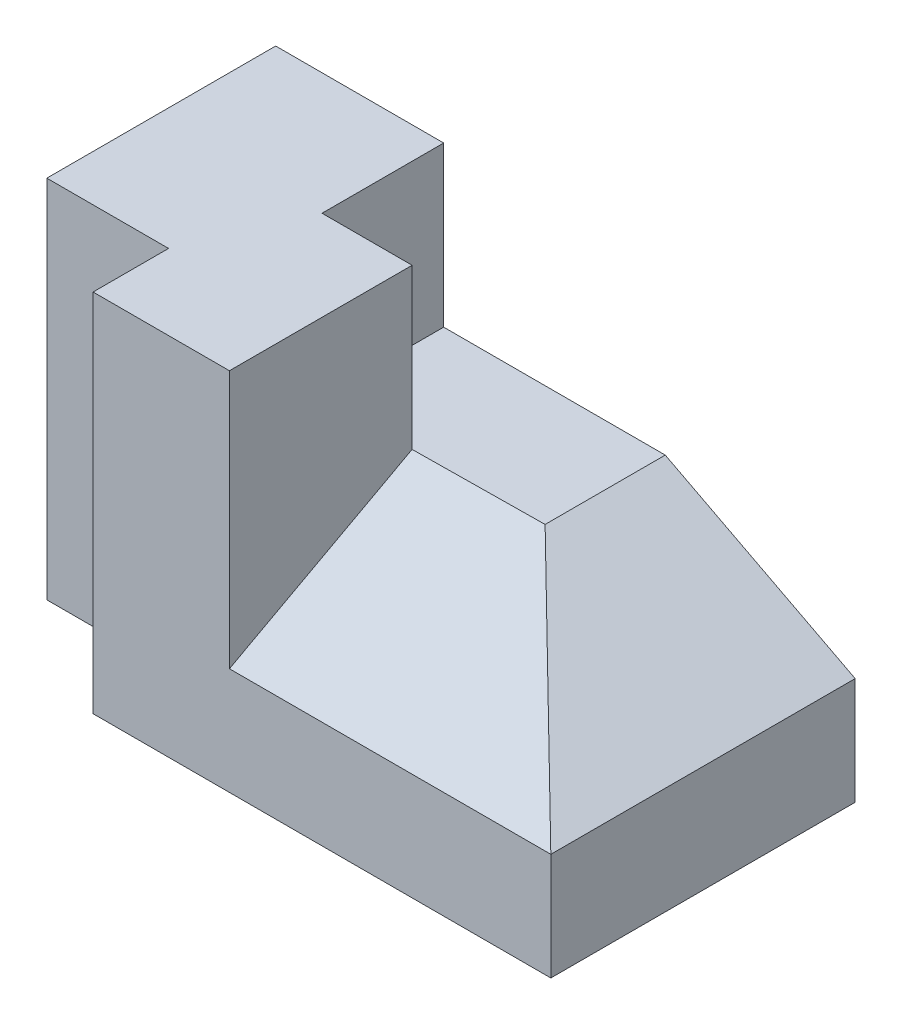
ISO-10303-21;
HEADER;
FILE_DESCRIPTION(('STEP AP214'),'2;1');
FILE_NAME('part.step','',(''),(''),'','','');
FILE_SCHEMA(('AUTOMOTIVE_DESIGN { 1 0 10303 214 1 1 1 1 }'));
ENDSEC;
DATA;
#1=APPLICATION_CONTEXT('core data for automotive mechanical design processes');
#2=APPLICATION_PROTOCOL_DEFINITION('international standard','automotive_design',2000,#1);
#3=PRODUCT_CONTEXT('',#1,'mechanical');
#4=PRODUCT('Part','Part','',(#3));
#5=PRODUCT_RELATED_PRODUCT_CATEGORY('part','',(#4));
#6=PRODUCT_DEFINITION_FORMATION('','',#4);
#7=PRODUCT_DEFINITION_CONTEXT('part definition',#1,'design');
#8=PRODUCT_DEFINITION('design','',#6,#7);
#9=PRODUCT_DEFINITION_SHAPE('','',#8);
#10=(LENGTH_UNIT() NAMED_UNIT(*) SI_UNIT(.MILLI.,.METRE.));
#11=(NAMED_UNIT(*) PLANE_ANGLE_UNIT() SI_UNIT($,.RADIAN.));
#12=(NAMED_UNIT(*) SI_UNIT($,.STERADIAN.) SOLID_ANGLE_UNIT());
#13=UNCERTAINTY_MEASURE_WITH_UNIT(LENGTH_MEASURE(1.E-05),#10,'distance_accuracy_value','');
#14=(GEOMETRIC_REPRESENTATION_CONTEXT(3) GLOBAL_UNCERTAINTY_ASSIGNED_CONTEXT((#13)) GLOBAL_UNIT_ASSIGNED_CONTEXT((#10,
#11,#12)) REPRESENTATION_CONTEXT('',''));
#15=CARTESIAN_POINT('',(0.,0.,0.));
#16=DIRECTION('',(0.,0.,1.));
#17=DIRECTION('',(1.,0.,0.));
#18=AXIS2_PLACEMENT_3D('',#15,#16,#17);
#19=CARTESIAN_POINT('',(4.76,3.,0.));
#20=DIRECTION('',(-1.,0.,0.));
#21=DIRECTION('',(0.,0.,1.));
#22=AXIS2_PLACEMENT_3D('',#19,#20,#21);
#23=PLANE('',#22);
#24=DIRECTION('',(0.,0.,-1.));
#25=VECTOR('',#24,1.);
#26=CARTESIAN_POINT('',(4.76,0.88,0.));
#27=LINE('',#26,#25);
#28=CARTESIAN_POINT('',(4.76,0.88,0.));
#29=VERTEX_POINT('',#28);
#30=CARTESIAN_POINT('',(4.76,0.88,-2.5));
#31=VERTEX_POINT('',#30);
#32=EDGE_CURVE('E155',#29,#31,#27,.T.);
#33=ORIENTED_EDGE('',*,*,#32,.F.);
#34=DIRECTION('',(0.,-1.,0.));
#35=VECTOR('',#34,1.);
#36=CARTESIAN_POINT('',(4.76,3.,0.));
#37=LINE('',#36,#35);
#38=CARTESIAN_POINT('',(4.76,0.,0.));
#39=VERTEX_POINT('',#38);
#40=EDGE_CURVE('E12',#29,#39,#37,.T.);
#41=ORIENTED_EDGE('',*,*,#40,.T.);
#42=DIRECTION('',(0.,0.,-1.));
#43=VECTOR('',#42,1.);
#44=CARTESIAN_POINT('',(4.76,0.,0.));
#45=LINE('',#44,#43);
#46=CARTESIAN_POINT('',(4.76,0.,-2.5));
#47=VERTEX_POINT('',#46);
#48=EDGE_CURVE('E255',#39,#47,#45,.T.);
#49=ORIENTED_EDGE('',*,*,#48,.T.);
#50=DIRECTION('',(0.,-1.,0.));
#51=VECTOR('',#50,1.);
#52=CARTESIAN_POINT('',(4.76,3.,-2.5));
#53=LINE('',#52,#51);
#54=EDGE_CURVE('E67',#31,#47,#53,.T.);
#55=ORIENTED_EDGE('',*,*,#54,.F.);
#56=EDGE_LOOP('',(#33,#41,#49,#55));
#57=FACE_BOUND('',#56,.T.);
#58=ADVANCED_FACE('F56',(#57),#23,.F.);
#59=CARTESIAN_POINT('',(0.,3.,0.));
#60=DIRECTION('',(0.,0.,-1.));
#61=DIRECTION('',(-1.,0.,0.));
#62=AXIS2_PLACEMENT_3D('',#59,#60,#61);
#63=PLANE('',#62);
#64=DIRECTION('',(1.,0.,0.));
#65=VECTOR('',#64,1.);
#66=CARTESIAN_POINT('',(0.,0.88,0.));
#67=LINE('',#66,#65);
#68=CARTESIAN_POINT('',(2.12,0.88,0.));
#69=VERTEX_POINT('',#68);
#70=EDGE_CURVE('E143',#69,#29,#67,.T.);
#71=ORIENTED_EDGE('',*,*,#70,.F.);
#72=DIRECTION('',(0.,1.,0.));
#73=VECTOR('',#72,1.);
#74=CARTESIAN_POINT('',(2.12,1.69,0.));
#75=LINE('',#74,#73);
#76=CARTESIAN_POINT('',(2.12,3.,0.));
#77=VERTEX_POINT('',#76);
#78=EDGE_CURVE('E147',#69,#77,#75,.T.);
#79=ORIENTED_EDGE('',*,*,#78,.T.);
#80=DIRECTION('',(1.,0.,0.));
#81=VECTOR('',#80,1.);
#82=CARTESIAN_POINT('',(0.,3.,0.));
#83=LINE('',#82,#81);
#84=CARTESIAN_POINT('',(1.,3.,0.));
#85=VERTEX_POINT('',#84);
#86=EDGE_CURVE('E241',#85,#77,#83,.T.);
#87=ORIENTED_EDGE('',*,*,#86,.F.);
#88=DIRECTION('',(0.,1.,0.));
#89=VECTOR('',#88,1.);
#90=CARTESIAN_POINT('',(1.,0.,0.));
#91=LINE('',#90,#89);
#92=CARTESIAN_POINT('',(1.,0.,0.));
#93=VERTEX_POINT('',#92);
#94=EDGE_CURVE('E221',#93,#85,#91,.T.);
#95=ORIENTED_EDGE('',*,*,#94,.F.);
#96=DIRECTION('',(1.,0.,0.));
#97=VECTOR('',#96,1.);
#98=CARTESIAN_POINT('',(0.,0.,0.));
#99=LINE('',#98,#97);
#100=EDGE_CURVE('E252',#93,#39,#99,.T.);
#101=ORIENTED_EDGE('',*,*,#100,.T.);
#102=ORIENTED_EDGE('',*,*,#40,.F.);
#103=EDGE_LOOP('',(#71,#79,#87,#95,#101,#102));
#104=FACE_BOUND('',#103,.T.);
#105=ADVANCED_FACE('F145',(#104),#63,.F.);
#106=CARTESIAN_POINT('',(4.76,3.,-2.5));
#107=DIRECTION('',(0.,0.,1.));
#108=DIRECTION('',(1.,0.,0.));
#109=AXIS2_PLACEMENT_3D('',#106,#107,#108);
#110=PLANE('',#109);
#111=DIRECTION('',(0.,1.,0.));
#112=VECTOR('',#111,1.);
#113=CARTESIAN_POINT('',(1.38,1.69,-2.5));
#114=LINE('',#113,#112);
#115=CARTESIAN_POINT('',(1.38,1.69,-2.5));
#116=VERTEX_POINT('',#115);
#117=CARTESIAN_POINT('',(1.38,3.,-2.5));
#118=VERTEX_POINT('',#117);
#119=EDGE_CURVE('E164',#116,#118,#114,.T.);
#120=ORIENTED_EDGE('',*,*,#119,.F.);
#121=DIRECTION('',(-1.,0.,0.));
#122=VECTOR('',#121,1.);
#123=CARTESIAN_POINT('',(0.,1.69,-2.5));
#124=LINE('',#123,#122);
#125=CARTESIAN_POINT('',(3.2,1.69,-2.5));
#126=VERTEX_POINT('',#125);
#127=EDGE_CURVE('E60',#126,#116,#124,.T.);
#128=ORIENTED_EDGE('',*,*,#127,.F.);
#129=DIRECTION('',(0.88749607680174,-0.460815270647057,0.));
#130=VECTOR('',#129,1.);
#131=CARTESIAN_POINT('',(3.2,1.69,-2.5));
#132=LINE('',#131,#130);
#133=EDGE_CURVE('E170',#126,#31,#132,.T.);
#134=ORIENTED_EDGE('',*,*,#133,.T.);
#135=ORIENTED_EDGE('',*,*,#54,.T.);
#136=DIRECTION('',(-1.,0.,0.));
#137=VECTOR('',#136,1.);
#138=CARTESIAN_POINT('',(4.76,0.,-2.5));
#139=LINE('',#138,#137);
#140=CARTESIAN_POINT('',(0.,0.,-2.5));
#141=VERTEX_POINT('',#140);
#142=EDGE_CURVE('E242',#47,#141,#139,.T.);
#143=ORIENTED_EDGE('',*,*,#142,.T.);
#144=DIRECTION('',(0.,-1.,0.));
#145=VECTOR('',#144,1.);
#146=CARTESIAN_POINT('',(0.,3.,-2.5));
#147=LINE('',#146,#145);
#148=CARTESIAN_POINT('',(0.,3.,-2.5));
#149=VERTEX_POINT('',#148);
#150=EDGE_CURVE('E248',#149,#141,#147,.T.);
#151=ORIENTED_EDGE('',*,*,#150,.F.);
#152=DIRECTION('',(-1.,0.,0.));
#153=VECTOR('',#152,1.);
#154=CARTESIAN_POINT('',(4.76,3.,-2.5));
#155=LINE('',#154,#153);
#156=EDGE_CURVE('E245',#118,#149,#155,.T.);
#157=ORIENTED_EDGE('',*,*,#156,.F.);
#158=EDGE_LOOP('',(#120,#128,#134,#135,#143,#151,#157));
#159=FACE_BOUND('',#158,.T.);
#160=ADVANCED_FACE('F268',(#159),#110,.F.);
#161=CARTESIAN_POINT('',(0.,3.,0.));
#162=DIRECTION('',(0.,1.,0.));
#163=DIRECTION('',(0.,0.,1.));
#164=AXIS2_PLACEMENT_3D('',#161,#162,#163);
#165=PLANE('',#164);
#166=DIRECTION('',(1.,0.,0.));
#167=VECTOR('',#166,1.);
#168=CARTESIAN_POINT('',(0.,3.,-1.50056625221014));
#169=LINE('',#168,#167);
#170=CARTESIAN_POINT('',(1.38,3.,-1.50056625221014));
#171=VERTEX_POINT('',#170);
#172=CARTESIAN_POINT('',(2.12,3.,-1.50056625221014));
#173=VERTEX_POINT('',#172);
#174=EDGE_CURVE('E82',#171,#173,#169,.T.);
#175=ORIENTED_EDGE('',*,*,#174,.F.);
#176=DIRECTION('',(0.,0.,-1.));
#177=VECTOR('',#176,1.);
#178=CARTESIAN_POINT('',(1.38,3.,0.));
#179=LINE('',#178,#177);
#180=EDGE_CURVE('E190',#171,#118,#179,.T.);
#181=ORIENTED_EDGE('',*,*,#180,.T.);
#182=ORIENTED_EDGE('',*,*,#156,.T.);
#183=DIRECTION('',(0.,0.,1.));
#184=VECTOR('',#183,1.);
#185=CARTESIAN_POINT('',(0.,3.,-2.5));
#186=LINE('',#185,#184);
#187=CARTESIAN_POINT('',(0.,3.,-0.62));
#188=VERTEX_POINT('',#187);
#189=EDGE_CURVE('E237',#149,#188,#186,.T.);
#190=ORIENTED_EDGE('',*,*,#189,.T.);
#191=DIRECTION('',(-1.,0.,0.));
#192=VECTOR('',#191,1.);
#193=CARTESIAN_POINT('',(0.,3.,-0.62));
#194=LINE('',#193,#192);
#195=CARTESIAN_POINT('',(1.,3.,-0.62));
#196=VERTEX_POINT('',#195);
#197=EDGE_CURVE('E217',#196,#188,#194,.T.);
#198=ORIENTED_EDGE('',*,*,#197,.F.);
#199=DIRECTION('',(0.,0.,-1.));
#200=VECTOR('',#199,1.);
#201=CARTESIAN_POINT('',(1.,3.,-0.62));
#202=LINE('',#201,#200);
#203=EDGE_CURVE('E207',#85,#196,#202,.T.);
#204=ORIENTED_EDGE('',*,*,#203,.F.);
#205=ORIENTED_EDGE('',*,*,#86,.T.);
#206=DIRECTION('',(0.,0.,-1.));
#207=VECTOR('',#206,1.);
#208=CARTESIAN_POINT('',(2.12,3.,0.));
#209=LINE('',#208,#207);
#210=EDGE_CURVE('E162',#77,#173,#209,.T.);
#211=ORIENTED_EDGE('',*,*,#210,.T.);
#212=EDGE_LOOP('',(#175,#181,#182,#190,#198,#204,#205,#211));
#213=FACE_BOUND('',#212,.T.);
#214=ADVANCED_FACE('F282',(#213),#165,.T.);
#215=CARTESIAN_POINT('',(0.,3.,-2.5));
#216=DIRECTION('',(1.,0.,0.));
#217=DIRECTION('',(0.,0.,-1.));
#218=AXIS2_PLACEMENT_3D('',#215,#216,#217);
#219=PLANE('',#218);
#220=DIRECTION('',(0.,0.,1.));
#221=VECTOR('',#220,1.);
#222=CARTESIAN_POINT('',(0.,0.,-2.5));
#223=LINE('',#222,#221);
#224=CARTESIAN_POINT('',(0.,0.,-0.62));
#225=VERTEX_POINT('',#224);
#226=EDGE_CURVE('E231',#141,#225,#223,.T.);
#227=ORIENTED_EDGE('',*,*,#226,.T.);
#228=DIRECTION('',(0.,1.,0.));
#229=VECTOR('',#228,1.);
#230=CARTESIAN_POINT('',(0.,0.,-0.62));
#231=LINE('',#230,#229);
#232=EDGE_CURVE('E227',#225,#188,#231,.T.);
#233=ORIENTED_EDGE('',*,*,#232,.T.);
#234=ORIENTED_EDGE('',*,*,#189,.F.);
#235=ORIENTED_EDGE('',*,*,#150,.T.);
#236=EDGE_LOOP('',(#227,#233,#234,#235));
#237=FACE_BOUND('',#236,.T.);
#238=ADVANCED_FACE('F58',(#237),#219,.F.);
#239=CARTESIAN_POINT('',(0.,0.,0.));
#240=DIRECTION('',(0.,1.,0.));
#241=DIRECTION('',(0.,0.,1.));
#242=AXIS2_PLACEMENT_3D('',#239,#240,#241);
#243=PLANE('',#242);
#244=DIRECTION('',(0.,0.,-1.));
#245=VECTOR('',#244,1.);
#246=CARTESIAN_POINT('',(1.,0.,-0.62));
#247=LINE('',#246,#245);
#248=CARTESIAN_POINT('',(1.,0.,-0.62));
#249=VERTEX_POINT('',#248);
#250=EDGE_CURVE('E212',#93,#249,#247,.T.);
#251=ORIENTED_EDGE('',*,*,#250,.T.);
#252=DIRECTION('',(-1.,0.,0.));
#253=VECTOR('',#252,1.);
#254=CARTESIAN_POINT('',(0.,0.,-0.62));
#255=LINE('',#254,#253);
#256=EDGE_CURVE('E216',#249,#225,#255,.T.);
#257=ORIENTED_EDGE('',*,*,#256,.T.);
#258=ORIENTED_EDGE('',*,*,#226,.F.);
#259=ORIENTED_EDGE('',*,*,#142,.F.);
#260=ORIENTED_EDGE('',*,*,#48,.F.);
#261=ORIENTED_EDGE('',*,*,#100,.F.);
#262=EDGE_LOOP('',(#251,#257,#258,#259,#260,#261));
#263=FACE_BOUND('',#262,.T.);
#264=ADVANCED_FACE('F277',(#263),#243,.F.);
#265=CARTESIAN_POINT('',(0.,0.,-0.62));
#266=DIRECTION('',(0.,0.,-1.));
#267=DIRECTION('',(-1.,0.,0.));
#268=AXIS2_PLACEMENT_3D('',#265,#266,#267);
#269=PLANE('',#268);
#270=ORIENTED_EDGE('',*,*,#197,.T.);
#271=ORIENTED_EDGE('',*,*,#232,.F.);
#272=ORIENTED_EDGE('',*,*,#256,.F.);
#273=DIRECTION('',(0.,1.,0.));
#274=VECTOR('',#273,1.);
#275=CARTESIAN_POINT('',(1.,0.,-0.62));
#276=LINE('',#275,#274);
#277=EDGE_CURVE('E232',#249,#196,#276,.T.);
#278=ORIENTED_EDGE('',*,*,#277,.T.);
#279=EDGE_LOOP('',(#270,#271,#272,#278));
#280=FACE_BOUND('',#279,.T.);
#281=ADVANCED_FACE('F297',(#280),#269,.F.);
#282=CARTESIAN_POINT('',(1.,0.,-0.62));
#283=DIRECTION('',(1.,0.,0.));
#284=DIRECTION('',(0.,0.,-1.));
#285=AXIS2_PLACEMENT_3D('',#282,#283,#284);
#286=PLANE('',#285);
#287=ORIENTED_EDGE('',*,*,#203,.T.);
#288=ORIENTED_EDGE('',*,*,#277,.F.);
#289=ORIENTED_EDGE('',*,*,#250,.F.);
#290=ORIENTED_EDGE('',*,*,#94,.T.);
#291=EDGE_LOOP('',(#287,#288,#289,#290));
#292=FACE_BOUND('',#291,.T.);
#293=ADVANCED_FACE('F295',(#292),#286,.F.);
#294=CARTESIAN_POINT('',(0.,1.69,-1.50056625221014));
#295=DIRECTION('',(0.,0.,1.));
#296=DIRECTION('',(1.,0.,0.));
#297=AXIS2_PLACEMENT_3D('',#294,#295,#296);
#298=PLANE('',#297);
#299=ORIENTED_EDGE('',*,*,#174,.T.);
#300=DIRECTION('',(0.,1.,0.));
#301=VECTOR('',#300,1.);
#302=CARTESIAN_POINT('',(2.12,1.69,-1.50056625221014));
#303=LINE('',#302,#301);
#304=CARTESIAN_POINT('',(2.12,1.69,-1.50056625221014));
#305=VERTEX_POINT('',#304);
#306=EDGE_CURVE('E165',#305,#173,#303,.T.);
#307=ORIENTED_EDGE('',*,*,#306,.F.);
#308=DIRECTION('',(1.,0.,0.));
#309=VECTOR('',#308,1.);
#310=CARTESIAN_POINT('',(0.,1.69,-1.50056625221014));
#311=LINE('',#310,#309);
#312=CARTESIAN_POINT('',(1.38,1.69,-1.50056625221014));
#313=VERTEX_POINT('',#312);
#314=EDGE_CURVE('E187',#313,#305,#311,.T.);
#315=ORIENTED_EDGE('',*,*,#314,.F.);
#316=DIRECTION('',(0.,1.,0.));
#317=VECTOR('',#316,1.);
#318=CARTESIAN_POINT('',(1.38,1.69,-1.50056625221014));
#319=LINE('',#318,#317);
#320=EDGE_CURVE('E204',#313,#171,#319,.T.);
#321=ORIENTED_EDGE('',*,*,#320,.T.);
#322=EDGE_LOOP('',(#299,#307,#315,#321));
#323=FACE_BOUND('',#322,.T.);
#324=ADVANCED_FACE('F290',(#323),#298,.F.);
#325=CARTESIAN_POINT('',(1.38,1.69,0.));
#326=DIRECTION('',(1.,0.,0.));
#327=DIRECTION('',(0.,0.,-1.));
#328=AXIS2_PLACEMENT_3D('',#325,#326,#327);
#329=PLANE('',#328);
#330=ORIENTED_EDGE('',*,*,#180,.F.);
#331=ORIENTED_EDGE('',*,*,#320,.F.);
#332=DIRECTION('',(0.,0.,-1.));
#333=VECTOR('',#332,1.);
#334=CARTESIAN_POINT('',(1.38,1.69,0.));
#335=LINE('',#334,#333);
#336=EDGE_CURVE('E193',#313,#116,#335,.T.);
#337=ORIENTED_EDGE('',*,*,#336,.T.);
#338=ORIENTED_EDGE('',*,*,#119,.T.);
#339=EDGE_LOOP('',(#330,#331,#337,#338));
#340=FACE_BOUND('',#339,.T.);
#341=ADVANCED_FACE('F286',(#340),#329,.T.);
#342=CARTESIAN_POINT('',(2.12,1.69,0.));
#343=DIRECTION('',(1.,0.,0.));
#344=DIRECTION('',(0.,0.,-1.));
#345=AXIS2_PLACEMENT_3D('',#342,#343,#344);
#346=PLANE('',#345);
#347=DIRECTION('',(0.,-0.475010075587675,0.879980356650188));
#348=VECTOR('',#347,1.);
#349=CARTESIAN_POINT('',(2.12,1.285,-0.75028312610507));
#350=LINE('',#349,#348);
#351=EDGE_CURVE('E160',#305,#69,#350,.T.);
#352=ORIENTED_EDGE('',*,*,#351,.F.);
#353=ORIENTED_EDGE('',*,*,#306,.T.);
#354=ORIENTED_EDGE('',*,*,#210,.F.);
#355=ORIENTED_EDGE('',*,*,#78,.F.);
#356=EDGE_LOOP('',(#352,#353,#354,#355));
#357=FACE_BOUND('',#356,.T.);
#358=ADVANCED_FACE('F159',(#357),#346,.T.);
#359=CARTESIAN_POINT('',(0.,1.69,0.));
#360=DIRECTION('',(0.,1.,0.));
#361=DIRECTION('',(0.,0.,1.));
#362=AXIS2_PLACEMENT_3D('',#359,#360,#361);
#363=PLANE('',#362);
#364=DIRECTION('',(-0.999932723432104,0.,0.0115995090265031));
#365=VECTOR('',#364,1.);
#366=CARTESIAN_POINT('',(-0.0171194177302828,1.69,-1.47577504836635));
#367=LINE('',#366,#365);
#368=CARTESIAN_POINT('',(3.2,1.69,-1.51309456482064));
#369=VERTEX_POINT('',#368);
#370=EDGE_CURVE('E156',#369,#305,#367,.T.);
#371=ORIENTED_EDGE('',*,*,#370,.F.);
#372=DIRECTION('',(0.,0.,1.));
#373=VECTOR('',#372,1.);
#374=CARTESIAN_POINT('',(3.2,1.69,0.));
#375=LINE('',#374,#373);
#376=EDGE_CURVE('E74',#126,#369,#375,.T.);
#377=ORIENTED_EDGE('',*,*,#376,.F.);
#378=ORIENTED_EDGE('',*,*,#127,.T.);
#379=ORIENTED_EDGE('',*,*,#336,.F.);
#380=ORIENTED_EDGE('',*,*,#314,.T.);
#381=EDGE_LOOP('',(#371,#377,#378,#379,#380));
#382=FACE_BOUND('',#381,.T.);
#383=ADVANCED_FACE('F289',(#382),#363,.T.);
#384=CARTESIAN_POINT('',(3.2,1.69,-1.51309456482064));
#385=CARTESIAN_POINT('',(4.76,0.88,0.));
#386=CARTESIAN_POINT('',(3.02,1.69,-1.51100651271889));
#387=CARTESIAN_POINT('',(4.31999999999999,0.88,0.));
#388=CARTESIAN_POINT('',(2.83999999999999,1.69,-1.50891846061714));
#389=CARTESIAN_POINT('',(3.87999999999999,0.88,0.));
#390=CARTESIAN_POINT('',(2.47999999999999,1.69,-1.50474235641364));
#391=CARTESIAN_POINT('',(2.99999999999999,0.88,0.));
#392=CARTESIAN_POINT('',(2.3,1.69,-1.50265430431189));
#393=CARTESIAN_POINT('',(2.55999999999999,0.88,0.));
#394=CARTESIAN_POINT('',(2.12,1.69,-1.50056625221014));
#395=CARTESIAN_POINT('',(2.12,0.88,0.));
#396=B_SPLINE_SURFACE_WITH_KNOTS('',3,1,((#384,#385),(#386,#387),(#388,#389),(#390,#391),(#392,
#393),(#394,#395)),.UNSPECIFIED.,.F.,.F.,.F.,(4,2,4),(2,2),(0.,0.5,1.),(0.,1.),.UNSPECIFIED.);
#397=DIRECTION('',(-0.672616570747967,0.349243219426829,-0.652392613722465));
#398=VECTOR('',#397,1.);
#399=CARTESIAN_POINT('',(3.98,1.285,-0.756547282410319));
#400=LINE('',#399,#398);
#401=EDGE_CURVE('E171',#29,#369,#400,.T.);
#402=ORIENTED_EDGE('',*,*,#370,.T.);
#403=ORIENTED_EDGE('',*,*,#351,.T.);
#404=ORIENTED_EDGE('',*,*,#70,.T.);
#405=ORIENTED_EDGE('',*,*,#401,.T.);
#406=EDGE_LOOP('',(#402,#403,#404,#405));
#407=FACE_BOUND('',#406,.T.);
#408=ADVANCED_FACE('F168',(#407),#396,.T.);
#409=CARTESIAN_POINT('',(1.37068453247888,2.63983687736674,0.));
#410=DIRECTION('',(0.460815270647057,0.88749607680174,0.));
#411=DIRECTION('',(-0.88749607680174,0.460815270647057,0.));
#412=AXIS2_PLACEMENT_3D('',#409,#410,#411);
#413=PLANE('',#412);
#414=ORIENTED_EDGE('',*,*,#401,.F.);
#415=ORIENTED_EDGE('',*,*,#32,.T.);
#416=ORIENTED_EDGE('',*,*,#133,.F.);
#417=ORIENTED_EDGE('',*,*,#376,.T.);
#418=EDGE_LOOP('',(#414,#415,#416,#417));
#419=FACE_BOUND('',#418,.T.);
#420=ADVANCED_FACE('F405',(#419),#413,.T.);
#421=CLOSED_SHELL('',(#58,#105,#160,#214,#238,#264,#281,#293,#324,#341,#358,#383,#408,#420));
#422=MANIFOLD_SOLID_BREP('B2',#421);
#423=ADVANCED_BREP_SHAPE_REPRESENTATION('',(#18,#422),#14);
#424=SHAPE_DEFINITION_REPRESENTATION(#9,#423);
ENDSEC;
END-ISO-10303-21;
